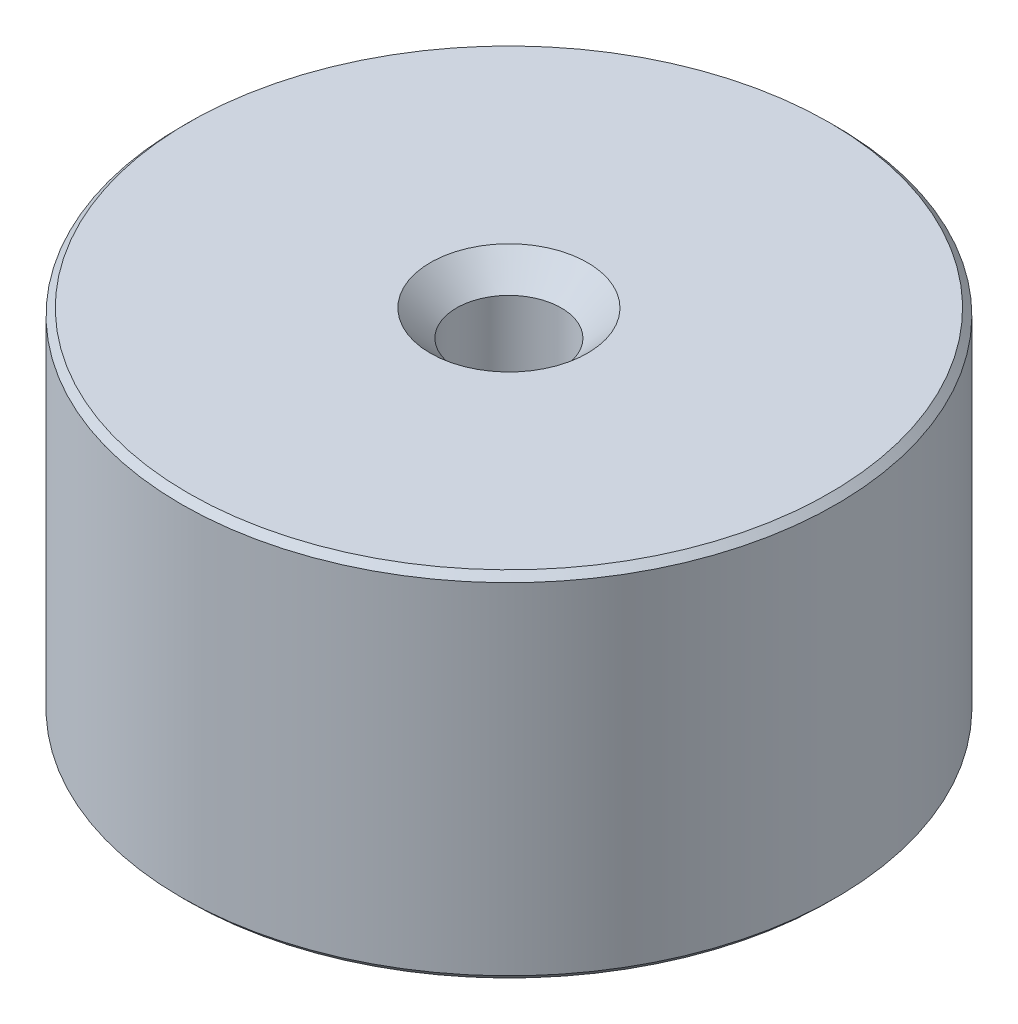
ISO-10303-21;
HEADER;
FILE_DESCRIPTION(('STEP AP214'),'2;1');
FILE_NAME('part.step','',(''),(''),'','','');
FILE_SCHEMA(('AUTOMOTIVE_DESIGN { 1 0 10303 214 1 1 1 1 }'));
ENDSEC;
DATA;
#1=APPLICATION_CONTEXT('core data for automotive mechanical design processes');
#2=APPLICATION_PROTOCOL_DEFINITION('international standard','automotive_design',2000,#1);
#3=PRODUCT_CONTEXT('',#1,'mechanical');
#4=PRODUCT('Part','Part','',(#3));
#5=PRODUCT_RELATED_PRODUCT_CATEGORY('part','',(#4));
#6=PRODUCT_DEFINITION_FORMATION('','',#4);
#7=PRODUCT_DEFINITION_CONTEXT('part definition',#1,'design');
#8=PRODUCT_DEFINITION('design','',#6,#7);
#9=PRODUCT_DEFINITION_SHAPE('','',#8);
#10=(LENGTH_UNIT() NAMED_UNIT(*) SI_UNIT(.MILLI.,.METRE.));
#11=(NAMED_UNIT(*) PLANE_ANGLE_UNIT() SI_UNIT($,.RADIAN.));
#12=(NAMED_UNIT(*) SI_UNIT($,.STERADIAN.) SOLID_ANGLE_UNIT());
#13=UNCERTAINTY_MEASURE_WITH_UNIT(LENGTH_MEASURE(1.E-05),#10,'distance_accuracy_value','');
#14=(GEOMETRIC_REPRESENTATION_CONTEXT(3) GLOBAL_UNCERTAINTY_ASSIGNED_CONTEXT((#13)) GLOBAL_UNIT_ASSIGNED_CONTEXT((#10,
#11,#12)) REPRESENTATION_CONTEXT('',''));
#15=CARTESIAN_POINT('',(0.,0.,0.));
#16=DIRECTION('',(0.,0.,1.));
#17=DIRECTION('',(1.,0.,0.));
#18=AXIS2_PLACEMENT_3D('',#15,#16,#17);
#19=CARTESIAN_POINT('',(0.,27.,0.));
#20=DIRECTION('',(0.,-1.,0.));
#21=DIRECTION('',(0.,0.,-1.));
#22=AXIS2_PLACEMENT_3D('',#19,#20,#21);
#23=CYLINDRICAL_SURFACE('',#22,25.);
#24=CARTESIAN_POINT('',(0.,0.500000000000011,0.));
#25=DIRECTION('',(0.,1.,0.));
#26=DIRECTION('',(0.,0.,1.));
#27=AXIS2_PLACEMENT_3D('',#24,#25,#26);
#28=CIRCLE('',#27,25.);
#29=CARTESIAN_POINT('',(0.,0.500000000000011,25.));
#30=VERTEX_POINT('',#29);
#31=EDGE_CURVE('E72',#30,#30,#28,.T.);
#32=ORIENTED_EDGE('',*,*,#31,.T.);
#33=EDGE_LOOP('',(#32));
#34=FACE_BOUND('',#33,.T.);
#35=CARTESIAN_POINT('',(0.,26.5,0.));
#36=DIRECTION('',(0.,1.,0.));
#37=DIRECTION('',(0.,0.,1.));
#38=AXIS2_PLACEMENT_3D('',#35,#36,#37);
#39=CIRCLE('',#38,25.);
#40=CARTESIAN_POINT('',(0.,26.5,25.));
#41=VERTEX_POINT('',#40);
#42=EDGE_CURVE('E69',#41,#41,#39,.F.);
#43=ORIENTED_EDGE('',*,*,#42,.T.);
#44=EDGE_LOOP('',(#43));
#45=FACE_BOUND('',#44,.T.);
#46=ADVANCED_FACE('F36',(#34,#45),#23,.T.);
#47=CARTESIAN_POINT('',(0.,27.,0.));
#48=DIRECTION('',(0.,1.,0.));
#49=DIRECTION('',(0.,0.,1.));
#50=AXIS2_PLACEMENT_3D('',#47,#48,#49);
#51=PLANE('',#50);
#52=CARTESIAN_POINT('',(0.,27.,0.));
#53=DIRECTION('',(0.,1.,0.));
#54=DIRECTION('',(0.,0.,1.));
#55=AXIS2_PLACEMENT_3D('',#52,#53,#54);
#56=CIRCLE('',#55,24.5);
#57=CARTESIAN_POINT('',(0.,27.,24.5));
#58=VERTEX_POINT('',#57);
#59=EDGE_CURVE('E78',#58,#58,#56,.T.);
#60=ORIENTED_EDGE('',*,*,#59,.T.);
#61=EDGE_LOOP('',(#60));
#62=FACE_BOUND('',#61,.T.);
#63=CARTESIAN_POINT('',(0.,27.,0.));
#64=DIRECTION('',(0.,1.,0.));
#65=DIRECTION('',(0.,0.,1.));
#66=AXIS2_PLACEMENT_3D('',#63,#64,#65);
#67=CIRCLE('',#66,6.00000000000001);
#68=CARTESIAN_POINT('',(0.,27.,6.00000000000001));
#69=VERTEX_POINT('',#68);
#70=EDGE_CURVE('E60',#69,#69,#67,.F.);
#71=ORIENTED_EDGE('',*,*,#70,.T.);
#72=EDGE_LOOP('',(#71));
#73=FACE_BOUND('',#72,.T.);
#74=ADVANCED_FACE('F116',(#62,#73),#51,.T.);
#75=CARTESIAN_POINT('',(0.,0.,0.));
#76=DIRECTION('',(0.,1.,0.));
#77=DIRECTION('',(0.,0.,1.));
#78=AXIS2_PLACEMENT_3D('',#75,#76,#77);
#79=PLANE('',#78);
#80=CARTESIAN_POINT('',(0.,0.,0.));
#81=DIRECTION('',(0.,-1.,0.));
#82=DIRECTION('',(0.,0.,-1.));
#83=AXIS2_PLACEMENT_3D('',#80,#81,#82);
#84=CIRCLE('',#83,18.);
#85=CARTESIAN_POINT('',(0.,0.,-18.));
#86=VERTEX_POINT('',#85);
#87=EDGE_CURVE('E63',#86,#86,#84,.T.);
#88=ORIENTED_EDGE('',*,*,#87,.F.);
#89=EDGE_LOOP('',(#88));
#90=FACE_BOUND('',#89,.T.);
#91=CARTESIAN_POINT('',(0.,0.,0.));
#92=DIRECTION('',(0.,1.,0.));
#93=DIRECTION('',(0.,0.,1.));
#94=AXIS2_PLACEMENT_3D('',#91,#92,#93);
#95=CIRCLE('',#94,24.5);
#96=CARTESIAN_POINT('',(0.,0.,24.5));
#97=VERTEX_POINT('',#96);
#98=EDGE_CURVE('E75',#97,#97,#95,.F.);
#99=ORIENTED_EDGE('',*,*,#98,.T.);
#100=EDGE_LOOP('',(#99));
#101=FACE_BOUND('',#100,.T.);
#102=ADVANCED_FACE('F110',(#90,#101),#79,.F.);
#103=CARTESIAN_POINT('',(0.,15.,0.));
#104=DIRECTION('',(0.,1.,0.));
#105=DIRECTION('',(0.,0.,1.));
#106=AXIS2_PLACEMENT_3D('',#103,#104,#105);
#107=CYLINDRICAL_SURFACE('',#106,4.);
#108=CARTESIAN_POINT('',(0.,25.,0.));
#109=DIRECTION('',(0.,1.,0.));
#110=DIRECTION('',(0.,0.,1.));
#111=AXIS2_PLACEMENT_3D('',#108,#109,#110);
#112=CIRCLE('',#111,4.);
#113=CARTESIAN_POINT('',(0.,25.,4.));
#114=VERTEX_POINT('',#113);
#115=EDGE_CURVE('E56',#114,#114,#112,.T.);
#116=ORIENTED_EDGE('',*,*,#115,.T.);
#117=EDGE_LOOP('',(#116));
#118=FACE_BOUND('',#117,.T.);
#119=CARTESIAN_POINT('',(0.,15.,0.));
#120=DIRECTION('',(0.,-1.,0.));
#121=DIRECTION('',(0.,0.,-1.));
#122=AXIS2_PLACEMENT_3D('',#119,#120,#121);
#123=CIRCLE('',#122,4.);
#124=CARTESIAN_POINT('',(0.,15.,-4.));
#125=VERTEX_POINT('',#124);
#126=EDGE_CURVE('E54',#125,#125,#123,.T.);
#127=ORIENTED_EDGE('',*,*,#126,.T.);
#128=EDGE_LOOP('',(#127));
#129=FACE_BOUND('',#128,.T.);
#130=ADVANCED_FACE('F50',(#118,#129),#107,.F.);
#131=CARTESIAN_POINT('',(0.,15.,0.));
#132=DIRECTION('',(0.,1.,0.));
#133=DIRECTION('',(0.,0.,1.));
#134=AXIS2_PLACEMENT_3D('',#131,#132,#133);
#135=CONICAL_SURFACE('',#134,4.,0.94247779607694);
#136=CARTESIAN_POINT('',(0.,12.0938298879786,0.));
#137=VERTEX_POINT('',#136);
#138=VERTEX_LOOP('',#137);
#139=FACE_BOUND('',#138,.T.);
#140=ORIENTED_EDGE('',*,*,#126,.F.);
#141=EDGE_LOOP('',(#140));
#142=FACE_BOUND('',#141,.T.);
#143=ADVANCED_FACE('F46',(#139,#142),#135,.F.);
#144=CARTESIAN_POINT('',(0.,25.,0.));
#145=DIRECTION('',(0.,1.,0.));
#146=DIRECTION('',(0.,0.,1.));
#147=AXIS2_PLACEMENT_3D('',#144,#145,#146);
#148=CONICAL_SURFACE('',#147,4.,0.785398163397448);
#149=ORIENTED_EDGE('',*,*,#70,.F.);
#150=EDGE_LOOP('',(#149));
#151=FACE_BOUND('',#150,.T.);
#152=ORIENTED_EDGE('',*,*,#115,.F.);
#153=EDGE_LOOP('',(#152));
#154=FACE_BOUND('',#153,.T.);
#155=ADVANCED_FACE('F49',(#151,#154),#148,.F.);
#156=CARTESIAN_POINT('',(0.,0.500000000000011,0.));
#157=DIRECTION('',(0.,1.,0.));
#158=DIRECTION('',(0.,0.,1.));
#159=AXIS2_PLACEMENT_3D('',#156,#157,#158);
#160=CONICAL_SURFACE('',#159,25.,0.785398163397448);
#161=ORIENTED_EDGE('',*,*,#98,.F.);
#162=EDGE_LOOP('',(#161));
#163=FACE_BOUND('',#162,.T.);
#164=ORIENTED_EDGE('',*,*,#31,.F.);
#165=EDGE_LOOP('',(#164));
#166=FACE_BOUND('',#165,.T.);
#167=ADVANCED_FACE('F128',(#163,#166),#160,.T.);
#168=CARTESIAN_POINT('',(0.,27.,0.));
#169=DIRECTION('',(0.,-1.,0.));
#170=DIRECTION('',(0.,0.,-1.));
#171=AXIS2_PLACEMENT_3D('',#168,#169,#170);
#172=CONICAL_SURFACE('',#171,24.5,0.785398163397434);
#173=ORIENTED_EDGE('',*,*,#42,.F.);
#174=EDGE_LOOP('',(#173));
#175=FACE_BOUND('',#174,.T.);
#176=ORIENTED_EDGE('',*,*,#59,.F.);
#177=EDGE_LOOP('',(#176));
#178=FACE_BOUND('',#177,.T.);
#179=ADVANCED_FACE('F132',(#175,#178),#172,.T.);
#180=CARTESIAN_POINT('',(0.,2.,0.));
#181=DIRECTION('',(0.,-1.,0.));
#182=DIRECTION('',(0.,0.,-1.));
#183=AXIS2_PLACEMENT_3D('',#180,#181,#182);
#184=CYLINDRICAL_SURFACE('',#183,18.);
#185=CARTESIAN_POINT('',(0.,2.,0.));
#186=DIRECTION('',(0.,-1.,0.));
#187=DIRECTION('',(0.,0.,-1.));
#188=AXIS2_PLACEMENT_3D('',#185,#186,#187);
#189=CIRCLE('',#188,18.);
#190=CARTESIAN_POINT('',(0.,2.,-18.));
#191=VERTEX_POINT('',#190);
#192=EDGE_CURVE('E57',#191,#191,#189,.T.);
#193=ORIENTED_EDGE('',*,*,#192,.F.);
#194=EDGE_LOOP('',(#193));
#195=FACE_BOUND('',#194,.T.);
#196=ORIENTED_EDGE('',*,*,#87,.T.);
#197=EDGE_LOOP('',(#196));
#198=FACE_BOUND('',#197,.T.);
#199=ADVANCED_FACE('F135',(#195,#198),#184,.F.);
#200=CARTESIAN_POINT('',(0.,2.,0.));
#201=DIRECTION('',(0.,-1.,0.));
#202=DIRECTION('',(0.,0.,-1.));
#203=AXIS2_PLACEMENT_3D('',#200,#201,#202);
#204=PLANE('',#203);
#205=CARTESIAN_POINT('',(0.,2.,0.));
#206=DIRECTION('',(0.,-1.,0.));
#207=DIRECTION('',(0.,0.,-1.));
#208=AXIS2_PLACEMENT_3D('',#205,#206,#207);
#209=CIRCLE('',#208,11.5);
#210=CARTESIAN_POINT('',(0.,2.,-11.5));
#211=VERTEX_POINT('',#210);
#212=EDGE_CURVE('E43',#211,#211,#209,.F.);
#213=ORIENTED_EDGE('',*,*,#212,.T.);
#214=EDGE_LOOP('',(#213));
#215=FACE_BOUND('',#214,.T.);
#216=ORIENTED_EDGE('',*,*,#192,.T.);
#217=EDGE_LOOP('',(#216));
#218=FACE_BOUND('',#217,.T.);
#219=ADVANCED_FACE('F89',(#215,#218),#204,.T.);
#220=CARTESIAN_POINT('',(0.,2.,0.));
#221=DIRECTION('',(0.,-1.,0.));
#222=DIRECTION('',(0.,0.,-1.));
#223=AXIS2_PLACEMENT_3D('',#220,#221,#222);
#224=CYLINDRICAL_SURFACE('',#223,11.);
#225=CARTESIAN_POINT('',(0.,1.49999999999999,0.));
#226=DIRECTION('',(0.,-1.,0.));
#227=DIRECTION('',(0.,0.,-1.));
#228=AXIS2_PLACEMENT_3D('',#225,#226,#227);
#229=CIRCLE('',#228,11.);
#230=CARTESIAN_POINT('',(0.,1.49999999999999,-11.));
#231=VERTEX_POINT('',#230);
#232=EDGE_CURVE('E84',#231,#231,#229,.T.);
#233=ORIENTED_EDGE('',*,*,#232,.T.);
#234=EDGE_LOOP('',(#233));
#235=FACE_BOUND('',#234,.T.);
#236=CARTESIAN_POINT('',(0.,0.500000000000014,0.));
#237=DIRECTION('',(0.,1.,0.));
#238=DIRECTION('',(0.,0.,1.));
#239=AXIS2_PLACEMENT_3D('',#236,#237,#238);
#240=CIRCLE('',#239,11.);
#241=CARTESIAN_POINT('',(0.,0.500000000000014,11.));
#242=VERTEX_POINT('',#241);
#243=EDGE_CURVE('E81',#242,#242,#240,.T.);
#244=ORIENTED_EDGE('',*,*,#243,.T.);
#245=EDGE_LOOP('',(#244));
#246=FACE_BOUND('',#245,.T.);
#247=ADVANCED_FACE('F98',(#235,#246),#224,.T.);
#248=CARTESIAN_POINT('',(0.,0.,0.));
#249=DIRECTION('',(0.,1.,0.));
#250=DIRECTION('',(0.,0.,1.));
#251=AXIS2_PLACEMENT_3D('',#248,#249,#250);
#252=CIRCLE('',#251,10.5);
#253=CARTESIAN_POINT('',(0.,0.,10.5));
#254=VERTEX_POINT('',#253);
#255=EDGE_CURVE('E11',#254,#254,#252,.F.);
#256=ORIENTED_EDGE('',*,*,#255,.T.);
#257=EDGE_LOOP('',(#256));
#258=FACE_BOUND('',#257,.T.);
#259=ADVANCED_FACE('F95',(#258),#79,.F.);
#260=CARTESIAN_POINT('',(0.,1.49999999999999,0.));
#261=DIRECTION('',(0.,1.,0.));
#262=DIRECTION('',(0.,0.,1.));
#263=AXIS2_PLACEMENT_3D('',#260,#261,#262);
#264=CONICAL_SURFACE('',#263,11.,0.785398163397438);
#265=ORIENTED_EDGE('',*,*,#212,.F.);
#266=EDGE_LOOP('',(#265));
#267=FACE_BOUND('',#266,.T.);
#268=ORIENTED_EDGE('',*,*,#232,.F.);
#269=EDGE_LOOP('',(#268));
#270=FACE_BOUND('',#269,.T.);
#271=ADVANCED_FACE('F92',(#267,#270),#264,.T.);
#272=CARTESIAN_POINT('',(0.,0.,0.));
#273=DIRECTION('',(0.,1.,0.));
#274=DIRECTION('',(0.,0.,1.));
#275=AXIS2_PLACEMENT_3D('',#272,#273,#274);
#276=CONICAL_SURFACE('',#275,10.5,0.785398163397445);
#277=ORIENTED_EDGE('',*,*,#243,.F.);
#278=EDGE_LOOP('',(#277));
#279=FACE_BOUND('',#278,.T.);
#280=ORIENTED_EDGE('',*,*,#255,.F.);
#281=EDGE_LOOP('',(#280));
#282=FACE_BOUND('',#281,.T.);
#283=ADVANCED_FACE('F38',(#279,#282),#276,.T.);
#284=CLOSED_SHELL('',(#46,#74,#102,#130,#143,#155,#167,#179,#199,#219,#247,#259,#271,#283));
#285=MANIFOLD_SOLID_BREP('B2',#284);
#286=ADVANCED_BREP_SHAPE_REPRESENTATION('',(#18,#285),#14);
#287=SHAPE_DEFINITION_REPRESENTATION(#9,#286);
ENDSEC;
END-ISO-10303-21;
